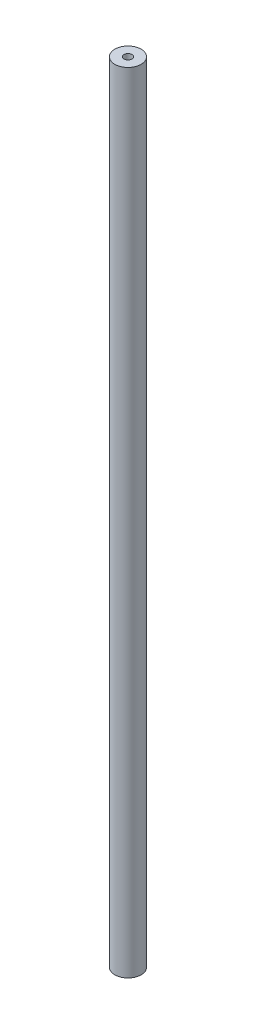
ISO-10303-21;
HEADER;
FILE_DESCRIPTION(('STEP AP214'),'2;1');
FILE_NAME('part.step','',(''),(''),'','','');
FILE_SCHEMA(('AUTOMOTIVE_DESIGN { 1 0 10303 214 1 1 1 1 }'));
ENDSEC;
DATA;
#1=APPLICATION_CONTEXT('core data for automotive mechanical design processes');
#2=APPLICATION_PROTOCOL_DEFINITION('international standard','automotive_design',2000,#1);
#3=PRODUCT_CONTEXT('',#1,'mechanical');
#4=PRODUCT('Part','Part','',(#3));
#5=PRODUCT_RELATED_PRODUCT_CATEGORY('part','',(#4));
#6=PRODUCT_DEFINITION_FORMATION('','',#4);
#7=PRODUCT_DEFINITION_CONTEXT('part definition',#1,'design');
#8=PRODUCT_DEFINITION('design','',#6,#7);
#9=PRODUCT_DEFINITION_SHAPE('','',#8);
#10=(LENGTH_UNIT() NAMED_UNIT(*) SI_UNIT(.MILLI.,.METRE.));
#11=(NAMED_UNIT(*) PLANE_ANGLE_UNIT() SI_UNIT($,.RADIAN.));
#12=(NAMED_UNIT(*) SI_UNIT($,.STERADIAN.) SOLID_ANGLE_UNIT());
#13=UNCERTAINTY_MEASURE_WITH_UNIT(LENGTH_MEASURE(1.E-05),#10,'distance_accuracy_value','');
#14=(GEOMETRIC_REPRESENTATION_CONTEXT(3) GLOBAL_UNCERTAINTY_ASSIGNED_CONTEXT((#13)) GLOBAL_UNIT_ASSIGNED_CONTEXT((#10,
#11,#12)) REPRESENTATION_CONTEXT('',''));
#15=CARTESIAN_POINT('',(0.,0.,0.));
#16=DIRECTION('',(0.,0.,1.));
#17=DIRECTION('',(1.,0.,0.));
#18=AXIS2_PLACEMENT_3D('',#15,#16,#17);
#19=CARTESIAN_POINT('',(0.,0.,0.));
#20=DIRECTION('',(0.,1.,0.));
#21=DIRECTION('',(0.,0.,1.));
#22=AXIS2_PLACEMENT_3D('',#19,#20,#21);
#23=CYLINDRICAL_SURFACE('',#22,2.5);
#24=CARTESIAN_POINT('',(0.,150.,0.));
#25=DIRECTION('',(0.,1.,0.));
#26=DIRECTION('',(0.,0.,1.));
#27=AXIS2_PLACEMENT_3D('',#24,#25,#26);
#28=CIRCLE('',#27,2.5);
#29=CARTESIAN_POINT('',(0.,150.,2.5));
#30=VERTEX_POINT('',#29);
#31=EDGE_CURVE('E35',#30,#30,#28,.T.);
#32=ORIENTED_EDGE('',*,*,#31,.F.);
#33=EDGE_LOOP('',(#32));
#34=FACE_BOUND('',#33,.T.);
#35=CARTESIAN_POINT('',(0.,0.,0.));
#36=DIRECTION('',(0.,1.,0.));
#37=DIRECTION('',(0.,0.,1.));
#38=AXIS2_PLACEMENT_3D('',#35,#36,#37);
#39=CIRCLE('',#38,2.5);
#40=CARTESIAN_POINT('',(0.,0.,2.5));
#41=VERTEX_POINT('',#40);
#42=EDGE_CURVE('E20',#41,#41,#39,.T.);
#43=ORIENTED_EDGE('',*,*,#42,.T.);
#44=EDGE_LOOP('',(#43));
#45=FACE_BOUND('',#44,.T.);
#46=ADVANCED_FACE('F17',(#34,#45),#23,.T.);
#47=CARTESIAN_POINT('',(0.,0.,0.));
#48=DIRECTION('',(0.,1.,0.));
#49=DIRECTION('',(0.,0.,1.));
#50=AXIS2_PLACEMENT_3D('',#47,#48,#49);
#51=PLANE('',#50);
#52=CARTESIAN_POINT('',(0.,0.,0.));
#53=DIRECTION('',(0.,1.,0.));
#54=DIRECTION('',(0.,0.,1.));
#55=AXIS2_PLACEMENT_3D('',#52,#53,#54);
#56=CIRCLE('',#55,0.75);
#57=CARTESIAN_POINT('',(0.,0.,0.75));
#58=VERTEX_POINT('',#57);
#59=EDGE_CURVE('E25',#58,#58,#56,.F.);
#60=ORIENTED_EDGE('',*,*,#59,.F.);
#61=EDGE_LOOP('',(#60));
#62=FACE_BOUND('',#61,.T.);
#63=ORIENTED_EDGE('',*,*,#42,.F.);
#64=EDGE_LOOP('',(#63));
#65=FACE_BOUND('',#64,.T.);
#66=ADVANCED_FACE('F53',(#62,#65),#51,.F.);
#67=CARTESIAN_POINT('',(0.,150.,0.));
#68=DIRECTION('',(0.,1.,0.));
#69=DIRECTION('',(0.,0.,1.));
#70=AXIS2_PLACEMENT_3D('',#67,#68,#69);
#71=PLANE('',#70);
#72=CARTESIAN_POINT('',(0.,150.,0.));
#73=DIRECTION('',(0.,1.,0.));
#74=DIRECTION('',(0.,0.,1.));
#75=AXIS2_PLACEMENT_3D('',#72,#73,#74);
#76=CIRCLE('',#75,0.75);
#77=CARTESIAN_POINT('',(0.,150.,0.75));
#78=VERTEX_POINT('',#77);
#79=EDGE_CURVE('E11',#78,#78,#76,.F.);
#80=ORIENTED_EDGE('',*,*,#79,.T.);
#81=EDGE_LOOP('',(#80));
#82=FACE_BOUND('',#81,.T.);
#83=ORIENTED_EDGE('',*,*,#31,.T.);
#84=EDGE_LOOP('',(#83));
#85=FACE_BOUND('',#84,.T.);
#86=ADVANCED_FACE('F42',(#82,#85),#71,.T.);
#87=CARTESIAN_POINT('',(0.,0.,0.));
#88=DIRECTION('',(0.,1.,0.));
#89=DIRECTION('',(0.,0.,1.));
#90=AXIS2_PLACEMENT_3D('',#87,#88,#89);
#91=CYLINDRICAL_SURFACE('',#90,0.75);
#92=ORIENTED_EDGE('',*,*,#79,.F.);
#93=EDGE_LOOP('',(#92));
#94=FACE_BOUND('',#93,.T.);
#95=ORIENTED_EDGE('',*,*,#59,.T.);
#96=EDGE_LOOP('',(#95));
#97=FACE_BOUND('',#96,.T.);
#98=ADVANCED_FACE('F45',(#94,#97),#91,.F.);
#99=CLOSED_SHELL('',(#46,#66,#86,#98));
#100=MANIFOLD_SOLID_BREP('B1',#99);
#101=ADVANCED_BREP_SHAPE_REPRESENTATION('',(#18,#100),#14);
#102=SHAPE_DEFINITION_REPRESENTATION(#9,#101);
ENDSEC;
END-ISO-10303-21;
